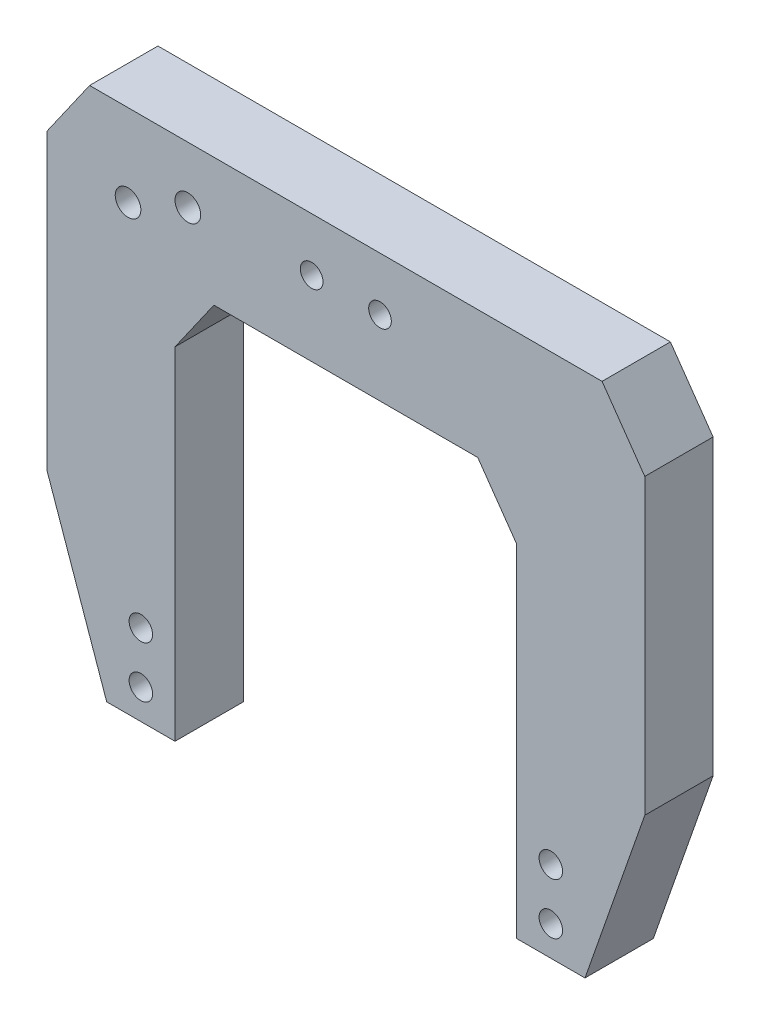
ISO-10303-21;
HEADER;
FILE_DESCRIPTION(('STEP AP214'),'2;1');
FILE_NAME('part.step','',(''),(''),'','','');
FILE_SCHEMA(('AUTOMOTIVE_DESIGN { 1 0 10303 214 1 1 1 1 }'));
ENDSEC;
DATA;
#1=APPLICATION_CONTEXT('core data for automotive mechanical design processes');
#2=APPLICATION_PROTOCOL_DEFINITION('international standard','automotive_design',2000,#1);
#3=PRODUCT_CONTEXT('',#1,'mechanical');
#4=PRODUCT('Part','Part','',(#3));
#5=PRODUCT_RELATED_PRODUCT_CATEGORY('part','',(#4));
#6=PRODUCT_DEFINITION_FORMATION('','',#4);
#7=PRODUCT_DEFINITION_CONTEXT('part definition',#1,'design');
#8=PRODUCT_DEFINITION('design','',#6,#7);
#9=PRODUCT_DEFINITION_SHAPE('','',#8);
#10=(LENGTH_UNIT() NAMED_UNIT(*) SI_UNIT(.MILLI.,.METRE.));
#11=(NAMED_UNIT(*) PLANE_ANGLE_UNIT() SI_UNIT($,.RADIAN.));
#12=(NAMED_UNIT(*) SI_UNIT($,.STERADIAN.) SOLID_ANGLE_UNIT());
#13=UNCERTAINTY_MEASURE_WITH_UNIT(LENGTH_MEASURE(1.E-05),#10,'distance_accuracy_value','');
#14=(GEOMETRIC_REPRESENTATION_CONTEXT(3) GLOBAL_UNCERTAINTY_ASSIGNED_CONTEXT((#13)) GLOBAL_UNIT_ASSIGNED_CONTEXT((#10,
#11,#12)) REPRESENTATION_CONTEXT('',''));
#15=CARTESIAN_POINT('',(0.,0.,0.));
#16=DIRECTION('',(0.,0.,1.));
#17=DIRECTION('',(1.,0.,0.));
#18=AXIS2_PLACEMENT_3D('',#15,#16,#17);
#19=CARTESIAN_POINT('',(30.8973020032737,93.,8.));
#20=DIRECTION('',(0.,1.,0.));
#21=DIRECTION('',(0.,0.,1.));
#22=AXIS2_PLACEMENT_3D('',#19,#20,#21);
#23=PLANE('',#22);
#24=DIRECTION('',(1.,0.,0.));
#25=VECTOR('',#24,1.);
#26=CARTESIAN_POINT('',(30.8973020032737,93.,-8.));
#27=LINE('',#26,#25);
#28=CARTESIAN_POINT('',(-30.8973020032737,93.,-8.));
#29=VERTEX_POINT('',#28);
#30=CARTESIAN_POINT('',(30.8973020032737,93.,-8.));
#31=VERTEX_POINT('',#30);
#32=EDGE_CURVE('E136',#29,#31,#27,.T.);
#33=ORIENTED_EDGE('',*,*,#32,.T.);
#34=DIRECTION('',(0.,0.,-1.));
#35=VECTOR('',#34,1.);
#36=CARTESIAN_POINT('',(30.8973020032737,93.,8.));
#37=LINE('',#36,#35);
#38=CARTESIAN_POINT('',(30.8973020032737,93.,8.));
#39=VERTEX_POINT('',#38);
#40=EDGE_CURVE('E11',#39,#31,#37,.T.);
#41=ORIENTED_EDGE('',*,*,#40,.F.);
#42=DIRECTION('',(1.,0.,0.));
#43=VECTOR('',#42,1.);
#44=CARTESIAN_POINT('',(30.8973020032737,93.,8.));
#45=LINE('',#44,#43);
#46=CARTESIAN_POINT('',(-30.8973020032737,93.,8.));
#47=VERTEX_POINT('',#46);
#48=EDGE_CURVE('E152',#47,#39,#45,.T.);
#49=ORIENTED_EDGE('',*,*,#48,.F.);
#50=DIRECTION('',(0.,0.,-1.));
#51=VECTOR('',#50,1.);
#52=CARTESIAN_POINT('',(-30.8973020032737,93.,8.));
#53=LINE('',#52,#51);
#54=EDGE_CURVE('E229',#47,#29,#53,.T.);
#55=ORIENTED_EDGE('',*,*,#54,.T.);
#56=EDGE_LOOP('',(#33,#41,#49,#55));
#57=FACE_BOUND('',#56,.T.);
#58=ADVANCED_FACE('F37',(#57),#23,.F.);
#59=CARTESIAN_POINT('',(40.,80.,8.));
#60=DIRECTION('',(0.819152044288991,0.573576436351047,0.));
#61=DIRECTION('',(-0.573576436351047,0.819152044288991,0.));
#62=AXIS2_PLACEMENT_3D('',#59,#60,#61);
#63=PLANE('',#62);
#64=DIRECTION('',(0.573576436351047,-0.819152044288991,0.));
#65=VECTOR('',#64,1.);
#66=CARTESIAN_POINT('',(40.,80.,-8.));
#67=LINE('',#66,#65);
#68=CARTESIAN_POINT('',(40.,80.,-8.));
#69=VERTEX_POINT('',#68);
#70=EDGE_CURVE('E139',#31,#69,#67,.T.);
#71=ORIENTED_EDGE('',*,*,#70,.T.);
#72=DIRECTION('',(0.,0.,-1.));
#73=VECTOR('',#72,1.);
#74=CARTESIAN_POINT('',(40.,80.,8.));
#75=LINE('',#74,#73);
#76=CARTESIAN_POINT('',(40.,80.,8.));
#77=VERTEX_POINT('',#76);
#78=EDGE_CURVE('E46',#77,#69,#75,.T.);
#79=ORIENTED_EDGE('',*,*,#78,.F.);
#80=DIRECTION('',(0.573576436351047,-0.819152044288991,0.));
#81=VECTOR('',#80,1.);
#82=CARTESIAN_POINT('',(40.,80.,8.));
#83=LINE('',#82,#81);
#84=EDGE_CURVE('E96',#39,#77,#83,.T.);
#85=ORIENTED_EDGE('',*,*,#84,.F.);
#86=ORIENTED_EDGE('',*,*,#40,.T.);
#87=EDGE_LOOP('',(#71,#79,#85,#86));
#88=FACE_BOUND('',#87,.T.);
#89=ADVANCED_FACE('F342',(#88),#63,.F.);
#90=CARTESIAN_POINT('',(40.,0.,8.));
#91=DIRECTION('',(1.,0.,0.));
#92=DIRECTION('',(0.,1.,0.));
#93=AXIS2_PLACEMENT_3D('',#90,#91,#92);
#94=PLANE('',#93);
#95=DIRECTION('',(0.,-1.,0.));
#96=VECTOR('',#95,1.);
#97=CARTESIAN_POINT('',(40.,0.,-8.));
#98=LINE('',#97,#96);
#99=CARTESIAN_POINT('',(40.,0.,-8.));
#100=VERTEX_POINT('',#99);
#101=EDGE_CURVE('E142',#69,#100,#98,.T.);
#102=ORIENTED_EDGE('',*,*,#101,.T.);
#103=DIRECTION('',(0.,0.,-1.));
#104=VECTOR('',#103,1.);
#105=CARTESIAN_POINT('',(40.,0.,8.));
#106=LINE('',#105,#104);
#107=CARTESIAN_POINT('',(40.,0.,8.));
#108=VERTEX_POINT('',#107);
#109=EDGE_CURVE('E156',#108,#100,#106,.T.);
#110=ORIENTED_EDGE('',*,*,#109,.F.);
#111=DIRECTION('',(0.,-1.,0.));
#112=VECTOR('',#111,1.);
#113=CARTESIAN_POINT('',(40.,0.,8.));
#114=LINE('',#113,#112);
#115=EDGE_CURVE('E267',#77,#108,#114,.T.);
#116=ORIENTED_EDGE('',*,*,#115,.F.);
#117=ORIENTED_EDGE('',*,*,#78,.T.);
#118=EDGE_LOOP('',(#102,#110,#116,#117));
#119=FACE_BOUND('',#118,.T.);
#120=ADVANCED_FACE('F271',(#119),#94,.F.);
#121=CARTESIAN_POINT('',(56.,0.,8.));
#122=DIRECTION('',(0.,1.,0.));
#123=DIRECTION('',(-1.,0.,0.));
#124=AXIS2_PLACEMENT_3D('',#121,#122,#123);
#125=PLANE('',#124);
#126=DIRECTION('',(1.,0.,0.));
#127=VECTOR('',#126,1.);
#128=CARTESIAN_POINT('',(56.,0.,-8.));
#129=LINE('',#128,#127);
#130=CARTESIAN_POINT('',(56.,0.,-8.));
#131=VERTEX_POINT('',#130);
#132=EDGE_CURVE('E144',#100,#131,#129,.T.);
#133=ORIENTED_EDGE('',*,*,#132,.T.);
#134=DIRECTION('',(0.,0.,-1.));
#135=VECTOR('',#134,1.);
#136=CARTESIAN_POINT('',(56.,0.,8.));
#137=LINE('',#136,#135);
#138=CARTESIAN_POINT('',(56.,0.,8.));
#139=VERTEX_POINT('',#138);
#140=EDGE_CURVE('E125',#139,#131,#137,.T.);
#141=ORIENTED_EDGE('',*,*,#140,.F.);
#142=DIRECTION('',(1.,0.,0.));
#143=VECTOR('',#142,1.);
#144=CARTESIAN_POINT('',(56.,0.,8.));
#145=LINE('',#144,#143);
#146=EDGE_CURVE('E116',#108,#139,#145,.T.);
#147=ORIENTED_EDGE('',*,*,#146,.F.);
#148=ORIENTED_EDGE('',*,*,#109,.T.);
#149=EDGE_LOOP('',(#133,#141,#147,#148));
#150=FACE_BOUND('',#149,.T.);
#151=ADVANCED_FACE('F275',(#150),#125,.F.);
#152=CARTESIAN_POINT('',(56.,0.,8.));
#153=DIRECTION('',(-0.943858356366017,0.330350424728106,0.));
#154=DIRECTION('',(-0.330350424728106,-0.943858356366017,0.));
#155=AXIS2_PLACEMENT_3D('',#152,#153,#154);
#156=PLANE('',#155);
#157=DIRECTION('',(0.330350424728106,0.943858356366017,0.));
#158=VECTOR('',#157,1.);
#159=CARTESIAN_POINT('',(56.,0.,-8.));
#160=LINE('',#159,#158);
#161=CARTESIAN_POINT('',(70.,40.,-8.));
#162=VERTEX_POINT('',#161);
#163=EDGE_CURVE('E124',#131,#162,#160,.T.);
#164=ORIENTED_EDGE('',*,*,#163,.T.);
#165=DIRECTION('',(0.,0.,-1.));
#166=VECTOR('',#165,1.);
#167=CARTESIAN_POINT('',(70.,40.,8.));
#168=LINE('',#167,#166);
#169=CARTESIAN_POINT('',(70.,40.,8.));
#170=VERTEX_POINT('',#169);
#171=EDGE_CURVE('E121',#170,#162,#168,.T.);
#172=ORIENTED_EDGE('',*,*,#171,.F.);
#173=DIRECTION('',(0.330350424728106,0.943858356366017,0.));
#174=VECTOR('',#173,1.);
#175=CARTESIAN_POINT('',(56.,0.,8.));
#176=LINE('',#175,#174);
#177=EDGE_CURVE('E110',#139,#170,#176,.T.);
#178=ORIENTED_EDGE('',*,*,#177,.F.);
#179=ORIENTED_EDGE('',*,*,#140,.T.);
#180=EDGE_LOOP('',(#164,#172,#178,#179));
#181=FACE_BOUND('',#180,.T.);
#182=ADVANCED_FACE('F122',(#181),#156,.F.);
#183=CARTESIAN_POINT('',(70.,108.718519932579,8.));
#184=DIRECTION('',(-1.,0.,0.));
#185=DIRECTION('',(0.,0.,1.));
#186=AXIS2_PLACEMENT_3D('',#183,#184,#185);
#187=PLANE('',#186);
#188=DIRECTION('',(0.,1.,0.));
#189=VECTOR('',#188,1.);
#190=CARTESIAN_POINT('',(70.,108.718519932579,-8.));
#191=LINE('',#190,#189);
#192=CARTESIAN_POINT('',(70.,108.718519932579,-8.));
#193=VERTEX_POINT('',#192);
#194=EDGE_CURVE('E82',#162,#193,#191,.T.);
#195=ORIENTED_EDGE('',*,*,#194,.T.);
#196=DIRECTION('',(0.,0.,-1.));
#197=VECTOR('',#196,1.);
#198=CARTESIAN_POINT('',(70.,108.718519932579,8.));
#199=LINE('',#198,#197);
#200=CARTESIAN_POINT('',(70.,108.718519932579,8.));
#201=VERTEX_POINT('',#200);
#202=EDGE_CURVE('E126',#201,#193,#199,.T.);
#203=ORIENTED_EDGE('',*,*,#202,.F.);
#204=DIRECTION('',(0.,1.,0.));
#205=VECTOR('',#204,1.);
#206=CARTESIAN_POINT('',(70.,108.718519932579,8.));
#207=LINE('',#206,#205);
#208=EDGE_CURVE('E114',#170,#201,#207,.T.);
#209=ORIENTED_EDGE('',*,*,#208,.F.);
#210=ORIENTED_EDGE('',*,*,#171,.T.);
#211=EDGE_LOOP('',(#195,#203,#209,#210));
#212=FACE_BOUND('',#211,.T.);
#213=ADVANCED_FACE('F128',(#212),#187,.F.);
#214=CARTESIAN_POINT('',(60.,123.,8.));
#215=DIRECTION('',(-0.819152044288991,-0.573576436351047,0.));
#216=DIRECTION('',(0.573576436351047,-0.819152044288991,0.));
#217=AXIS2_PLACEMENT_3D('',#214,#215,#216);
#218=PLANE('',#217);
#219=DIRECTION('',(-0.573576436351047,0.819152044288991,0.));
#220=VECTOR('',#219,1.);
#221=CARTESIAN_POINT('',(60.,123.,-8.));
#222=LINE('',#221,#220);
#223=CARTESIAN_POINT('',(60.,123.,-8.));
#224=VERTEX_POINT('',#223);
#225=EDGE_CURVE('E88',#193,#224,#222,.T.);
#226=ORIENTED_EDGE('',*,*,#225,.T.);
#227=DIRECTION('',(0.,0.,-1.));
#228=VECTOR('',#227,1.);
#229=CARTESIAN_POINT('',(60.,123.,8.));
#230=LINE('',#229,#228);
#231=CARTESIAN_POINT('',(60.,123.,8.));
#232=VERTEX_POINT('',#231);
#233=EDGE_CURVE('E135',#232,#224,#230,.T.);
#234=ORIENTED_EDGE('',*,*,#233,.F.);
#235=DIRECTION('',(-0.573576436351047,0.819152044288991,0.));
#236=VECTOR('',#235,1.);
#237=CARTESIAN_POINT('',(60.,123.,8.));
#238=LINE('',#237,#236);
#239=EDGE_CURVE('E55',#201,#232,#238,.T.);
#240=ORIENTED_EDGE('',*,*,#239,.F.);
#241=ORIENTED_EDGE('',*,*,#202,.T.);
#242=EDGE_LOOP('',(#226,#234,#240,#241));
#243=FACE_BOUND('',#242,.T.);
#244=ADVANCED_FACE('F357',(#243),#218,.F.);
#245=CARTESIAN_POINT('',(0.,123.,8.));
#246=DIRECTION('',(0.,-1.,0.));
#247=DIRECTION('',(0.,0.,-1.));
#248=AXIS2_PLACEMENT_3D('',#245,#246,#247);
#249=PLANE('',#248);
#250=DIRECTION('',(-1.,0.,0.));
#251=VECTOR('',#250,1.);
#252=CARTESIAN_POINT('',(0.,123.,-8.));
#253=LINE('',#252,#251);
#254=CARTESIAN_POINT('',(-60.,123.,-8.));
#255=VERTEX_POINT('',#254);
#256=EDGE_CURVE('E149',#224,#255,#253,.T.);
#257=ORIENTED_EDGE('',*,*,#256,.T.);
#258=DIRECTION('',(0.,0.,-1.));
#259=VECTOR('',#258,1.);
#260=CARTESIAN_POINT('',(-60.,123.,8.));
#261=LINE('',#260,#259);
#262=CARTESIAN_POINT('',(-60.,123.,8.));
#263=VERTEX_POINT('',#262);
#264=EDGE_CURVE('E140',#263,#255,#261,.T.);
#265=ORIENTED_EDGE('',*,*,#264,.F.);
#266=DIRECTION('',(-1.,0.,0.));
#267=VECTOR('',#266,1.);
#268=CARTESIAN_POINT('',(0.,123.,8.));
#269=LINE('',#268,#267);
#270=EDGE_CURVE('E130',#232,#263,#269,.T.);
#271=ORIENTED_EDGE('',*,*,#270,.F.);
#272=ORIENTED_EDGE('',*,*,#233,.T.);
#273=EDGE_LOOP('',(#257,#265,#271,#272));
#274=FACE_BOUND('',#273,.T.);
#275=ADVANCED_FACE('F284',(#274),#249,.F.);
#276=CARTESIAN_POINT('',(0.,0.,8.));
#277=DIRECTION('',(0.,0.,-1.));
#278=DIRECTION('',(-1.,0.,0.));
#279=AXIS2_PLACEMENT_3D('',#276,#277,#278);
#280=PLANE('',#279);
#281=CARTESIAN_POINT('',(-36.9999999993247,109.750000000309,8.00000000000006));
#282=DIRECTION('',(0.,0.,1.));
#283=DIRECTION('',(1.,0.,0.));
#284=AXIS2_PLACEMENT_3D('',#281,#282,#283);
#285=CIRCLE('',#284,2.99999999999999);
#286=CARTESIAN_POINT('',(-33.9999999993247,109.750000000309,8.00000000000006));
#287=VERTEX_POINT('',#286);
#288=EDGE_CURVE('E496',#287,#287,#285,.T.);
#289=ORIENTED_EDGE('',*,*,#288,.F.);
#290=EDGE_LOOP('',(#289));
#291=FACE_BOUND('',#290,.T.);
#292=CARTESIAN_POINT('',(-50.9999999993247,103.750000000309,8.00000000000006));
#293=DIRECTION('',(0.,0.,1.));
#294=DIRECTION('',(1.,0.,0.));
#295=AXIS2_PLACEMENT_3D('',#292,#293,#294);
#296=CIRCLE('',#295,2.99999999999999);
#297=CARTESIAN_POINT('',(-47.9999999993247,103.750000000309,8.00000000000006));
#298=VERTEX_POINT('',#297);
#299=EDGE_CURVE('E190',#298,#298,#296,.T.);
#300=ORIENTED_EDGE('',*,*,#299,.F.);
#301=EDGE_LOOP('',(#300));
#302=FACE_BOUND('',#301,.T.);
#303=CARTESIAN_POINT('',(48.,7.00000000000012,8.));
#304=DIRECTION('',(0.,0.,-1.));
#305=DIRECTION('',(-1.,0.,0.));
#306=AXIS2_PLACEMENT_3D('',#303,#304,#305);
#307=CIRCLE('',#306,2.75);
#308=CARTESIAN_POINT('',(45.25,7.00000000000012,8.));
#309=VERTEX_POINT('',#308);
#310=EDGE_CURVE('E181',#309,#309,#307,.T.);
#311=ORIENTED_EDGE('',*,*,#310,.T.);
#312=EDGE_LOOP('',(#311));
#313=FACE_BOUND('',#312,.T.);
#314=CARTESIAN_POINT('',(48.,19.0000000000001,8.));
#315=DIRECTION('',(0.,0.,-1.));
#316=DIRECTION('',(-1.,0.,0.));
#317=AXIS2_PLACEMENT_3D('',#314,#315,#316);
#318=CIRCLE('',#317,2.75);
#319=CARTESIAN_POINT('',(45.25,19.0000000000001,8.));
#320=VERTEX_POINT('',#319);
#321=EDGE_CURVE('E178',#320,#320,#318,.T.);
#322=ORIENTED_EDGE('',*,*,#321,.T.);
#323=EDGE_LOOP('',(#322));
#324=FACE_BOUND('',#323,.T.);
#325=CARTESIAN_POINT('',(-48.,7.00000000000012,8.));
#326=DIRECTION('',(0.,0.,-1.));
#327=DIRECTION('',(-1.,0.,0.));
#328=AXIS2_PLACEMENT_3D('',#325,#326,#327);
#329=CIRCLE('',#328,2.75);
#330=CARTESIAN_POINT('',(-50.75,7.00000000000012,8.));
#331=VERTEX_POINT('',#330);
#332=EDGE_CURVE('E174',#331,#331,#329,.T.);
#333=ORIENTED_EDGE('',*,*,#332,.T.);
#334=EDGE_LOOP('',(#333));
#335=FACE_BOUND('',#334,.T.);
#336=CARTESIAN_POINT('',(-48.,19.0000000000001,8.));
#337=DIRECTION('',(0.,0.,-1.));
#338=DIRECTION('',(-1.,0.,0.));
#339=AXIS2_PLACEMENT_3D('',#336,#337,#338);
#340=CIRCLE('',#339,2.75);
#341=CARTESIAN_POINT('',(-50.75,19.0000000000001,8.));
#342=VERTEX_POINT('',#341);
#343=EDGE_CURVE('E171',#342,#342,#340,.T.);
#344=ORIENTED_EDGE('',*,*,#343,.T.);
#345=EDGE_LOOP('',(#344));
#346=FACE_BOUND('',#345,.T.);
#347=CARTESIAN_POINT('',(-7.99999999998935,110.5,8.));
#348=DIRECTION('',(0.,0.,-1.));
#349=DIRECTION('',(-1.,0.,0.));
#350=AXIS2_PLACEMENT_3D('',#347,#348,#349);
#351=CIRCLE('',#350,2.64999999999999);
#352=CARTESIAN_POINT('',(-10.6499999999893,110.5,8.));
#353=VERTEX_POINT('',#352);
#354=EDGE_CURVE('E165',#353,#353,#351,.T.);
#355=ORIENTED_EDGE('',*,*,#354,.T.);
#356=EDGE_LOOP('',(#355));
#357=FACE_BOUND('',#356,.T.);
#358=CARTESIAN_POINT('',(8.00000000001064,110.5,8.));
#359=DIRECTION('',(0.,0.,-1.));
#360=DIRECTION('',(-1.,0.,0.));
#361=AXIS2_PLACEMENT_3D('',#358,#359,#360);
#362=CIRCLE('',#361,2.64999999999999);
#363=CARTESIAN_POINT('',(5.35000000001065,110.5,8.));
#364=VERTEX_POINT('',#363);
#365=EDGE_CURVE('E164',#364,#364,#362,.T.);
#366=ORIENTED_EDGE('',*,*,#365,.T.);
#367=EDGE_LOOP('',(#366));
#368=FACE_BOUND('',#367,.T.);
#369=ORIENTED_EDGE('',*,*,#48,.T.);
#370=ORIENTED_EDGE('',*,*,#84,.T.);
#371=ORIENTED_EDGE('',*,*,#115,.T.);
#372=ORIENTED_EDGE('',*,*,#146,.T.);
#373=ORIENTED_EDGE('',*,*,#177,.T.);
#374=ORIENTED_EDGE('',*,*,#208,.T.);
#375=ORIENTED_EDGE('',*,*,#239,.T.);
#376=ORIENTED_EDGE('',*,*,#270,.T.);
#377=DIRECTION('',(0.573576436351047,0.819152044288991,0.));
#378=VECTOR('',#377,1.);
#379=CARTESIAN_POINT('',(-60.,123.,8.));
#380=LINE('',#379,#378);
#381=CARTESIAN_POINT('',(-70.,108.718519932579,8.));
#382=VERTEX_POINT('',#381);
#383=EDGE_CURVE('E210',#382,#263,#380,.T.);
#384=ORIENTED_EDGE('',*,*,#383,.F.);
#385=DIRECTION('',(0.,1.,0.));
#386=VECTOR('',#385,1.);
#387=CARTESIAN_POINT('',(-70.,108.718519932579,8.));
#388=LINE('',#387,#386);
#389=CARTESIAN_POINT('',(-70.,40.,8.));
#390=VERTEX_POINT('',#389);
#391=EDGE_CURVE('E213',#390,#382,#388,.T.);
#392=ORIENTED_EDGE('',*,*,#391,.F.);
#393=DIRECTION('',(-0.330350424728106,0.943858356366017,0.));
#394=VECTOR('',#393,1.);
#395=CARTESIAN_POINT('',(-56.,0.,8.));
#396=LINE('',#395,#394);
#397=CARTESIAN_POINT('',(-56.,0.,8.));
#398=VERTEX_POINT('',#397);
#399=EDGE_CURVE('E217',#398,#390,#396,.T.);
#400=ORIENTED_EDGE('',*,*,#399,.F.);
#401=DIRECTION('',(-1.,0.,0.));
#402=VECTOR('',#401,1.);
#403=CARTESIAN_POINT('',(-56.,0.,8.));
#404=LINE('',#403,#402);
#405=CARTESIAN_POINT('',(-40.,0.,8.));
#406=VERTEX_POINT('',#405);
#407=EDGE_CURVE('E220',#406,#398,#404,.T.);
#408=ORIENTED_EDGE('',*,*,#407,.F.);
#409=DIRECTION('',(0.,-1.,0.));
#410=VECTOR('',#409,1.);
#411=CARTESIAN_POINT('',(-40.,0.,8.));
#412=LINE('',#411,#410);
#413=CARTESIAN_POINT('',(-40.,80.,8.));
#414=VERTEX_POINT('',#413);
#415=EDGE_CURVE('E223',#414,#406,#412,.T.);
#416=ORIENTED_EDGE('',*,*,#415,.F.);
#417=DIRECTION('',(-0.573576436351047,-0.819152044288991,0.));
#418=VECTOR('',#417,1.);
#419=CARTESIAN_POINT('',(-40.,80.,8.));
#420=LINE('',#419,#418);
#421=EDGE_CURVE('E226',#47,#414,#420,.T.);
#422=ORIENTED_EDGE('',*,*,#421,.F.);
#423=EDGE_LOOP('',(#369,#370,#371,#372,#373,#374,#375,#376,#384,#392,#400,#408,#416,#422));
#424=FACE_BOUND('',#423,.T.);
#425=ADVANCED_FACE('F112',(#291,#302,#313,#324,#335,#346,#357,#368,#424),#280,.F.);
#426=CARTESIAN_POINT('',(0.,0.,-8.));
#427=DIRECTION('',(0.,0.,-1.));
#428=DIRECTION('',(-1.,0.,0.));
#429=AXIS2_PLACEMENT_3D('',#426,#427,#428);
#430=PLANE('',#429);
#431=CARTESIAN_POINT('',(-36.9999999993247,109.750000000309,-8.));
#432=DIRECTION('',(0.,0.,-1.));
#433=DIRECTION('',(-1.,0.,0.));
#434=AXIS2_PLACEMENT_3D('',#431,#432,#433);
#435=CIRCLE('',#434,2.99999999999999);
#436=CARTESIAN_POINT('',(-39.9999999993247,109.750000000309,-8.));
#437=VERTEX_POINT('',#436);
#438=EDGE_CURVE('E40',#437,#437,#435,.T.);
#439=ORIENTED_EDGE('',*,*,#438,.F.);
#440=EDGE_LOOP('',(#439));
#441=FACE_BOUND('',#440,.T.);
#442=CARTESIAN_POINT('',(-50.9999999993247,103.750000000309,-8.));
#443=DIRECTION('',(0.,0.,-1.));
#444=DIRECTION('',(-1.,0.,0.));
#445=AXIS2_PLACEMENT_3D('',#442,#443,#444);
#446=CIRCLE('',#445,2.99999999999999);
#447=CARTESIAN_POINT('',(-53.9999999993247,103.750000000309,-8.));
#448=VERTEX_POINT('',#447);
#449=EDGE_CURVE('E184',#448,#448,#446,.T.);
#450=ORIENTED_EDGE('',*,*,#449,.F.);
#451=EDGE_LOOP('',(#450));
#452=FACE_BOUND('',#451,.T.);
#453=CARTESIAN_POINT('',(48.,7.00000000000012,-8.));
#454=DIRECTION('',(0.,0.,-1.));
#455=DIRECTION('',(-1.,0.,0.));
#456=AXIS2_PLACEMENT_3D('',#453,#454,#455);
#457=CIRCLE('',#456,2.75);
#458=CARTESIAN_POINT('',(45.25,7.00000000000012,-8.));
#459=VERTEX_POINT('',#458);
#460=EDGE_CURVE('E182',#459,#459,#457,.T.);
#461=ORIENTED_EDGE('',*,*,#460,.F.);
#462=EDGE_LOOP('',(#461));
#463=FACE_BOUND('',#462,.T.);
#464=CARTESIAN_POINT('',(48.,19.0000000000001,-8.));
#465=DIRECTION('',(0.,0.,-1.));
#466=DIRECTION('',(-1.,0.,0.));
#467=AXIS2_PLACEMENT_3D('',#464,#465,#466);
#468=CIRCLE('',#467,2.75);
#469=CARTESIAN_POINT('',(45.25,19.0000000000001,-8.));
#470=VERTEX_POINT('',#469);
#471=EDGE_CURVE('E179',#470,#470,#468,.T.);
#472=ORIENTED_EDGE('',*,*,#471,.F.);
#473=EDGE_LOOP('',(#472));
#474=FACE_BOUND('',#473,.T.);
#475=CARTESIAN_POINT('',(-48.,7.00000000000012,-8.));
#476=DIRECTION('',(0.,0.,-1.));
#477=DIRECTION('',(-1.,0.,0.));
#478=AXIS2_PLACEMENT_3D('',#475,#476,#477);
#479=CIRCLE('',#478,2.75);
#480=CARTESIAN_POINT('',(-50.75,7.00000000000012,-8.));
#481=VERTEX_POINT('',#480);
#482=EDGE_CURVE('E175',#481,#481,#479,.T.);
#483=ORIENTED_EDGE('',*,*,#482,.F.);
#484=EDGE_LOOP('',(#483));
#485=FACE_BOUND('',#484,.T.);
#486=CARTESIAN_POINT('',(-48.,19.0000000000001,-8.));
#487=DIRECTION('',(0.,0.,-1.));
#488=DIRECTION('',(-1.,0.,0.));
#489=AXIS2_PLACEMENT_3D('',#486,#487,#488);
#490=CIRCLE('',#489,2.75);
#491=CARTESIAN_POINT('',(-50.75,19.0000000000001,-8.));
#492=VERTEX_POINT('',#491);
#493=EDGE_CURVE('E170',#492,#492,#490,.T.);
#494=ORIENTED_EDGE('',*,*,#493,.F.);
#495=EDGE_LOOP('',(#494));
#496=FACE_BOUND('',#495,.T.);
#497=CARTESIAN_POINT('',(-7.99999999998935,110.5,-8.));
#498=DIRECTION('',(0.,0.,-1.));
#499=DIRECTION('',(-1.,0.,0.));
#500=AXIS2_PLACEMENT_3D('',#497,#498,#499);
#501=CIRCLE('',#500,2.64999999999999);
#502=CARTESIAN_POINT('',(-10.6499999999893,110.5,-8.));
#503=VERTEX_POINT('',#502);
#504=EDGE_CURVE('E166',#503,#503,#501,.T.);
#505=ORIENTED_EDGE('',*,*,#504,.F.);
#506=EDGE_LOOP('',(#505));
#507=FACE_BOUND('',#506,.T.);
#508=CARTESIAN_POINT('',(8.00000000001064,110.5,-8.));
#509=DIRECTION('',(0.,0.,-1.));
#510=DIRECTION('',(-1.,0.,0.));
#511=AXIS2_PLACEMENT_3D('',#508,#509,#510);
#512=CIRCLE('',#511,2.64999999999999);
#513=CARTESIAN_POINT('',(5.35000000001065,110.5,-8.));
#514=VERTEX_POINT('',#513);
#515=EDGE_CURVE('E161',#514,#514,#512,.T.);
#516=ORIENTED_EDGE('',*,*,#515,.F.);
#517=EDGE_LOOP('',(#516));
#518=FACE_BOUND('',#517,.T.);
#519=ORIENTED_EDGE('',*,*,#32,.F.);
#520=DIRECTION('',(-0.573576436351047,-0.819152044288991,0.));
#521=VECTOR('',#520,1.);
#522=CARTESIAN_POINT('',(-40.,80.,-8.));
#523=LINE('',#522,#521);
#524=CARTESIAN_POINT('',(-40.,80.,-8.));
#525=VERTEX_POINT('',#524);
#526=EDGE_CURVE('E214',#29,#525,#523,.T.);
#527=ORIENTED_EDGE('',*,*,#526,.T.);
#528=DIRECTION('',(0.,-1.,0.));
#529=VECTOR('',#528,1.);
#530=CARTESIAN_POINT('',(-40.,0.,-8.));
#531=LINE('',#530,#529);
#532=CARTESIAN_POINT('',(-40.,0.,-8.));
#533=VERTEX_POINT('',#532);
#534=EDGE_CURVE('E241',#525,#533,#531,.T.);
#535=ORIENTED_EDGE('',*,*,#534,.T.);
#536=DIRECTION('',(-1.,0.,0.));
#537=VECTOR('',#536,1.);
#538=CARTESIAN_POINT('',(-56.,0.,-8.));
#539=LINE('',#538,#537);
#540=CARTESIAN_POINT('',(-56.,0.,-8.));
#541=VERTEX_POINT('',#540);
#542=EDGE_CURVE('E238',#533,#541,#539,.T.);
#543=ORIENTED_EDGE('',*,*,#542,.T.);
#544=DIRECTION('',(-0.330350424728106,0.943858356366017,0.));
#545=VECTOR('',#544,1.);
#546=CARTESIAN_POINT('',(-56.,0.,-8.));
#547=LINE('',#546,#545);
#548=CARTESIAN_POINT('',(-70.,40.,-8.));
#549=VERTEX_POINT('',#548);
#550=EDGE_CURVE('E235',#541,#549,#547,.T.);
#551=ORIENTED_EDGE('',*,*,#550,.T.);
#552=DIRECTION('',(0.,1.,0.));
#553=VECTOR('',#552,1.);
#554=CARTESIAN_POINT('',(-70.,108.718519932579,-8.));
#555=LINE('',#554,#553);
#556=CARTESIAN_POINT('',(-70.,108.718519932579,-8.));
#557=VERTEX_POINT('',#556);
#558=EDGE_CURVE('E232',#549,#557,#555,.T.);
#559=ORIENTED_EDGE('',*,*,#558,.T.);
#560=DIRECTION('',(0.573576436351047,0.819152044288991,0.));
#561=VECTOR('',#560,1.);
#562=CARTESIAN_POINT('',(-60.,123.,-8.));
#563=LINE('',#562,#561);
#564=EDGE_CURVE('E209',#557,#255,#563,.T.);
#565=ORIENTED_EDGE('',*,*,#564,.T.);
#566=ORIENTED_EDGE('',*,*,#256,.F.);
#567=ORIENTED_EDGE('',*,*,#225,.F.);
#568=ORIENTED_EDGE('',*,*,#194,.F.);
#569=ORIENTED_EDGE('',*,*,#163,.F.);
#570=ORIENTED_EDGE('',*,*,#132,.F.);
#571=ORIENTED_EDGE('',*,*,#101,.F.);
#572=ORIENTED_EDGE('',*,*,#70,.F.);
#573=EDGE_LOOP('',(#519,#527,#535,#543,#551,#559,#565,#566,#567,#568,#569,#570,#571,#572));
#574=FACE_BOUND('',#573,.T.);
#575=ADVANCED_FACE('F278',(#441,#452,#463,#474,#485,#496,#507,#518,#574),#430,.T.);
#576=CARTESIAN_POINT('',(-60.,123.,8.));
#577=DIRECTION('',(-0.819152044288991,0.573576436351047,0.));
#578=DIRECTION('',(-0.573576436351047,-0.819152044288991,0.));
#579=AXIS2_PLACEMENT_3D('',#576,#577,#578);
#580=PLANE('',#579);
#581=ORIENTED_EDGE('',*,*,#564,.F.);
#582=DIRECTION('',(0.,0.,-1.));
#583=VECTOR('',#582,1.);
#584=CARTESIAN_POINT('',(-70.,108.718519932579,8.));
#585=LINE('',#584,#583);
#586=EDGE_CURVE('E260',#382,#557,#585,.T.);
#587=ORIENTED_EDGE('',*,*,#586,.F.);
#588=ORIENTED_EDGE('',*,*,#383,.T.);
#589=ORIENTED_EDGE('',*,*,#264,.T.);
#590=EDGE_LOOP('',(#581,#587,#588,#589));
#591=FACE_BOUND('',#590,.T.);
#592=ADVANCED_FACE('F290',(#591),#580,.T.);
#593=CARTESIAN_POINT('',(-70.,108.718519932579,8.));
#594=DIRECTION('',(-1.,0.,0.));
#595=DIRECTION('',(0.,0.,1.));
#596=AXIS2_PLACEMENT_3D('',#593,#594,#595);
#597=PLANE('',#596);
#598=ORIENTED_EDGE('',*,*,#558,.F.);
#599=DIRECTION('',(0.,0.,-1.));
#600=VECTOR('',#599,1.);
#601=CARTESIAN_POINT('',(-70.,40.,8.));
#602=LINE('',#601,#600);
#603=EDGE_CURVE('E257',#390,#549,#602,.T.);
#604=ORIENTED_EDGE('',*,*,#603,.F.);
#605=ORIENTED_EDGE('',*,*,#391,.T.);
#606=ORIENTED_EDGE('',*,*,#586,.T.);
#607=EDGE_LOOP('',(#598,#604,#605,#606));
#608=FACE_BOUND('',#607,.T.);
#609=ADVANCED_FACE('F302',(#608),#597,.T.);
#610=CARTESIAN_POINT('',(-56.,0.,8.));
#611=DIRECTION('',(-0.943858356366017,-0.330350424728106,0.));
#612=DIRECTION('',(0.330350424728106,-0.943858356366017,0.));
#613=AXIS2_PLACEMENT_3D('',#610,#611,#612);
#614=PLANE('',#613);
#615=ORIENTED_EDGE('',*,*,#550,.F.);
#616=DIRECTION('',(0.,0.,-1.));
#617=VECTOR('',#616,1.);
#618=CARTESIAN_POINT('',(-56.,0.,8.));
#619=LINE('',#618,#617);
#620=EDGE_CURVE('E254',#398,#541,#619,.T.);
#621=ORIENTED_EDGE('',*,*,#620,.F.);
#622=ORIENTED_EDGE('',*,*,#399,.T.);
#623=ORIENTED_EDGE('',*,*,#603,.T.);
#624=EDGE_LOOP('',(#615,#621,#622,#623));
#625=FACE_BOUND('',#624,.T.);
#626=ADVANCED_FACE('F308',(#625),#614,.T.);
#627=CARTESIAN_POINT('',(-56.,0.,8.));
#628=DIRECTION('',(0.,-1.,0.));
#629=DIRECTION('',(1.,0.,0.));
#630=AXIS2_PLACEMENT_3D('',#627,#628,#629);
#631=PLANE('',#630);
#632=ORIENTED_EDGE('',*,*,#542,.F.);
#633=DIRECTION('',(0.,0.,-1.));
#634=VECTOR('',#633,1.);
#635=CARTESIAN_POINT('',(-40.,0.,8.));
#636=LINE('',#635,#634);
#637=EDGE_CURVE('E251',#406,#533,#636,.T.);
#638=ORIENTED_EDGE('',*,*,#637,.F.);
#639=ORIENTED_EDGE('',*,*,#407,.T.);
#640=ORIENTED_EDGE('',*,*,#620,.T.);
#641=EDGE_LOOP('',(#632,#638,#639,#640));
#642=FACE_BOUND('',#641,.T.);
#643=ADVANCED_FACE('F338',(#642),#631,.T.);
#644=CARTESIAN_POINT('',(-40.,0.,8.));
#645=DIRECTION('',(1.,0.,0.));
#646=DIRECTION('',(0.,1.,0.));
#647=AXIS2_PLACEMENT_3D('',#644,#645,#646);
#648=PLANE('',#647);
#649=ORIENTED_EDGE('',*,*,#534,.F.);
#650=DIRECTION('',(0.,0.,-1.));
#651=VECTOR('',#650,1.);
#652=CARTESIAN_POINT('',(-40.,80.,8.));
#653=LINE('',#652,#651);
#654=EDGE_CURVE('E248',#414,#525,#653,.T.);
#655=ORIENTED_EDGE('',*,*,#654,.F.);
#656=ORIENTED_EDGE('',*,*,#415,.T.);
#657=ORIENTED_EDGE('',*,*,#637,.T.);
#658=EDGE_LOOP('',(#649,#655,#656,#657));
#659=FACE_BOUND('',#658,.T.);
#660=ADVANCED_FACE('F329',(#659),#648,.T.);
#661=CARTESIAN_POINT('',(-40.,80.,8.));
#662=DIRECTION('',(0.819152044288991,-0.573576436351047,0.));
#663=DIRECTION('',(0.573576436351047,0.819152044288991,0.));
#664=AXIS2_PLACEMENT_3D('',#661,#662,#663);
#665=PLANE('',#664);
#666=ORIENTED_EDGE('',*,*,#526,.F.);
#667=ORIENTED_EDGE('',*,*,#54,.F.);
#668=ORIENTED_EDGE('',*,*,#421,.T.);
#669=ORIENTED_EDGE('',*,*,#654,.T.);
#670=EDGE_LOOP('',(#666,#667,#668,#669));
#671=FACE_BOUND('',#670,.T.);
#672=ADVANCED_FACE('F326',(#671),#665,.T.);
#673=CARTESIAN_POINT('',(8.00000000001064,110.5,18.42735850168));
#674=DIRECTION('',(0.,0.,1.));
#675=DIRECTION('',(1.,0.,0.));
#676=AXIS2_PLACEMENT_3D('',#673,#674,#675);
#677=CYLINDRICAL_SURFACE('',#676,2.64999999999999);
#678=ORIENTED_EDGE('',*,*,#515,.T.);
#679=EDGE_LOOP('',(#678));
#680=FACE_BOUND('',#679,.T.);
#681=ORIENTED_EDGE('',*,*,#365,.F.);
#682=EDGE_LOOP('',(#681));
#683=FACE_BOUND('',#682,.T.);
#684=ADVANCED_FACE('F328',(#680,#683),#677,.F.);
#685=CARTESIAN_POINT('',(-7.99999999998935,110.5,18.42735850168));
#686=DIRECTION('',(0.,0.,1.));
#687=DIRECTION('',(1.,0.,0.));
#688=AXIS2_PLACEMENT_3D('',#685,#686,#687);
#689=CYLINDRICAL_SURFACE('',#688,2.64999999999999);
#690=ORIENTED_EDGE('',*,*,#504,.T.);
#691=EDGE_LOOP('',(#690));
#692=FACE_BOUND('',#691,.T.);
#693=ORIENTED_EDGE('',*,*,#354,.F.);
#694=EDGE_LOOP('',(#693));
#695=FACE_BOUND('',#694,.T.);
#696=ADVANCED_FACE('F335',(#692,#695),#689,.F.);
#697=CARTESIAN_POINT('',(-48.,19.0000000000001,-21.9999999999999));
#698=DIRECTION('',(0.,0.,-1.));
#699=DIRECTION('',(-1.,0.,0.));
#700=AXIS2_PLACEMENT_3D('',#697,#698,#699);
#701=CYLINDRICAL_SURFACE('',#700,2.75);
#702=ORIENTED_EDGE('',*,*,#493,.T.);
#703=EDGE_LOOP('',(#702));
#704=FACE_BOUND('',#703,.T.);
#705=ORIENTED_EDGE('',*,*,#343,.F.);
#706=EDGE_LOOP('',(#705));
#707=FACE_BOUND('',#706,.T.);
#708=ADVANCED_FACE('F413',(#704,#707),#701,.F.);
#709=CARTESIAN_POINT('',(-48.,7.00000000000012,-21.9999999999999));
#710=DIRECTION('',(0.,0.,-1.));
#711=DIRECTION('',(-1.,0.,0.));
#712=AXIS2_PLACEMENT_3D('',#709,#710,#711);
#713=CYLINDRICAL_SURFACE('',#712,2.75);
#714=ORIENTED_EDGE('',*,*,#482,.T.);
#715=EDGE_LOOP('',(#714));
#716=FACE_BOUND('',#715,.T.);
#717=ORIENTED_EDGE('',*,*,#332,.F.);
#718=EDGE_LOOP('',(#717));
#719=FACE_BOUND('',#718,.T.);
#720=ADVANCED_FACE('F423',(#716,#719),#713,.F.);
#721=CARTESIAN_POINT('',(48.,19.0000000000001,-21.9999999999999));
#722=DIRECTION('',(0.,0.,-1.));
#723=DIRECTION('',(-1.,0.,0.));
#724=AXIS2_PLACEMENT_3D('',#721,#722,#723);
#725=CYLINDRICAL_SURFACE('',#724,2.75);
#726=ORIENTED_EDGE('',*,*,#471,.T.);
#727=EDGE_LOOP('',(#726));
#728=FACE_BOUND('',#727,.T.);
#729=ORIENTED_EDGE('',*,*,#321,.F.);
#730=EDGE_LOOP('',(#729));
#731=FACE_BOUND('',#730,.T.);
#732=ADVANCED_FACE('F433',(#728,#731),#725,.F.);
#733=CARTESIAN_POINT('',(48.,7.00000000000012,-21.9999999999999));
#734=DIRECTION('',(0.,0.,-1.));
#735=DIRECTION('',(-1.,0.,0.));
#736=AXIS2_PLACEMENT_3D('',#733,#734,#735);
#737=CYLINDRICAL_SURFACE('',#736,2.75);
#738=ORIENTED_EDGE('',*,*,#460,.T.);
#739=EDGE_LOOP('',(#738));
#740=FACE_BOUND('',#739,.T.);
#741=ORIENTED_EDGE('',*,*,#310,.F.);
#742=EDGE_LOOP('',(#741));
#743=FACE_BOUND('',#742,.T.);
#744=ADVANCED_FACE('F443',(#740,#743),#737,.F.);
#745=CARTESIAN_POINT('',(-50.9999999993247,103.750000000309,8.00000000000006));
#746=DIRECTION('',(0.,0.,1.));
#747=DIRECTION('',(1.,0.,0.));
#748=AXIS2_PLACEMENT_3D('',#745,#746,#747);
#749=CYLINDRICAL_SURFACE('',#748,2.99999999999999);
#750=ORIENTED_EDGE('',*,*,#449,.T.);
#751=EDGE_LOOP('',(#750));
#752=FACE_BOUND('',#751,.T.);
#753=ORIENTED_EDGE('',*,*,#299,.T.);
#754=EDGE_LOOP('',(#753));
#755=FACE_BOUND('',#754,.T.);
#756=ADVANCED_FACE('F453',(#752,#755),#749,.F.);
#757=CARTESIAN_POINT('',(-36.9999999993247,109.750000000309,8.00000000000006));
#758=DIRECTION('',(0.,0.,1.));
#759=DIRECTION('',(1.,0.,0.));
#760=AXIS2_PLACEMENT_3D('',#757,#758,#759);
#761=CYLINDRICAL_SURFACE('',#760,2.99999999999999);
#762=ORIENTED_EDGE('',*,*,#438,.T.);
#763=EDGE_LOOP('',(#762));
#764=FACE_BOUND('',#763,.T.);
#765=ORIENTED_EDGE('',*,*,#288,.T.);
#766=EDGE_LOOP('',(#765));
#767=FACE_BOUND('',#766,.T.);
#768=ADVANCED_FACE('F478',(#764,#767),#761,.F.);
#769=CLOSED_SHELL('',(#58,#89,#120,#151,#182,#213,#244,#275,#425,#575,#592,#609,#626,#643,#660,
#672,#684,#696,#708,#720,#732,#744,#756,#768));
#770=MANIFOLD_SOLID_BREP('B2',#769);
#771=ADVANCED_BREP_SHAPE_REPRESENTATION('',(#18,#770),#14);
#772=SHAPE_DEFINITION_REPRESENTATION(#9,#771);
ENDSEC;
END-ISO-10303-21;
